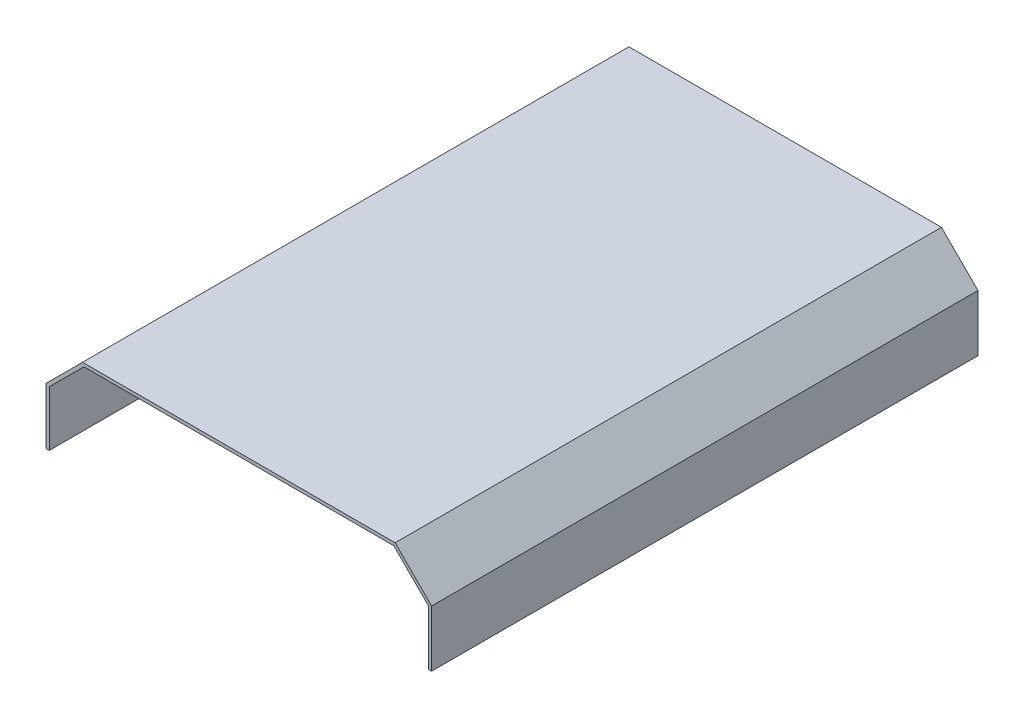
ISO-10303-21;
HEADER;
FILE_DESCRIPTION(('STEP AP214'),'2;1');
FILE_NAME('part.step','',(''),(''),'','','');
FILE_SCHEMA(('AUTOMOTIVE_DESIGN { 1 0 10303 214 1 1 1 1 }'));
ENDSEC;
DATA;
#1=APPLICATION_CONTEXT('core data for automotive mechanical design processes');
#2=APPLICATION_PROTOCOL_DEFINITION('international standard','automotive_design',2000,#1);
#3=PRODUCT_CONTEXT('',#1,'mechanical');
#4=PRODUCT('Part','Part','',(#3));
#5=PRODUCT_RELATED_PRODUCT_CATEGORY('part','',(#4));
#6=PRODUCT_DEFINITION_FORMATION('','',#4);
#7=PRODUCT_DEFINITION_CONTEXT('part definition',#1,'design');
#8=PRODUCT_DEFINITION('design','',#6,#7);
#9=PRODUCT_DEFINITION_SHAPE('','',#8);
#10=(LENGTH_UNIT() NAMED_UNIT(*) SI_UNIT(.MILLI.,.METRE.));
#11=(NAMED_UNIT(*) PLANE_ANGLE_UNIT() SI_UNIT($,.RADIAN.));
#12=(NAMED_UNIT(*) SI_UNIT($,.STERADIAN.) SOLID_ANGLE_UNIT());
#13=UNCERTAINTY_MEASURE_WITH_UNIT(LENGTH_MEASURE(1.E-05),#10,'distance_accuracy_value','');
#14=(GEOMETRIC_REPRESENTATION_CONTEXT(3) GLOBAL_UNCERTAINTY_ASSIGNED_CONTEXT((#13)) GLOBAL_UNIT_ASSIGNED_CONTEXT((#10,
#11,#12)) REPRESENTATION_CONTEXT('',''));
#15=CARTESIAN_POINT('',(0.,0.,0.));
#16=DIRECTION('',(0.,0.,1.));
#17=DIRECTION('',(1.,0.,0.));
#18=AXIS2_PLACEMENT_3D('',#15,#16,#17);
#19=CARTESIAN_POINT('',(-2.,0.,335.));
#20=DIRECTION('',(0.,1.,0.));
#21=DIRECTION('',(0.,0.,1.));
#22=AXIS2_PLACEMENT_3D('',#19,#20,#21);
#23=PLANE('',#22);
#24=DIRECTION('',(1.,0.,0.));
#25=VECTOR('',#24,1.);
#26=CARTESIAN_POINT('',(-2.,0.,0.));
#27=LINE('',#26,#25);
#28=CARTESIAN_POINT('',(-2.,0.,0.));
#29=VERTEX_POINT('',#28);
#30=CARTESIAN_POINT('',(0.,0.,0.));
#31=VERTEX_POINT('',#30);
#32=EDGE_CURVE('E153',#29,#31,#27,.T.);
#33=ORIENTED_EDGE('',*,*,#32,.T.);
#34=DIRECTION('',(0.,0.,-1.));
#35=VECTOR('',#34,1.);
#36=CARTESIAN_POINT('',(0.,0.,335.));
#37=LINE('',#36,#35);
#38=CARTESIAN_POINT('',(0.,0.,335.));
#39=VERTEX_POINT('',#38);
#40=EDGE_CURVE('E11',#39,#31,#37,.T.);
#41=ORIENTED_EDGE('',*,*,#40,.F.);
#42=DIRECTION('',(1.,0.,0.));
#43=VECTOR('',#42,1.);
#44=CARTESIAN_POINT('',(-2.,0.,335.));
#45=LINE('',#44,#43);
#46=CARTESIAN_POINT('',(-2.,0.,335.));
#47=VERTEX_POINT('',#46);
#48=EDGE_CURVE('E175',#47,#39,#45,.T.);
#49=ORIENTED_EDGE('',*,*,#48,.F.);
#50=DIRECTION('',(0.,0.,-1.));
#51=VECTOR('',#50,1.);
#52=CARTESIAN_POINT('',(-2.,0.,335.));
#53=LINE('',#52,#51);
#54=EDGE_CURVE('E149',#47,#29,#53,.T.);
#55=ORIENTED_EDGE('',*,*,#54,.T.);
#56=EDGE_LOOP('',(#33,#41,#49,#55));
#57=FACE_BOUND('',#56,.T.);
#58=ADVANCED_FACE('F33',(#57),#23,.F.);
#59=CARTESIAN_POINT('',(0.,0.,335.));
#60=DIRECTION('',(-1.,0.,0.));
#61=DIRECTION('',(0.,0.,1.));
#62=AXIS2_PLACEMENT_3D('',#59,#60,#61);
#63=PLANE('',#62);
#64=DIRECTION('',(0.,1.,0.));
#65=VECTOR('',#64,1.);
#66=CARTESIAN_POINT('',(0.,0.,0.));
#67=LINE('',#66,#65);
#68=CARTESIAN_POINT('',(0.,33.79,0.));
#69=VERTEX_POINT('',#68);
#70=EDGE_CURVE('E156',#31,#69,#67,.T.);
#71=ORIENTED_EDGE('',*,*,#70,.T.);
#72=DIRECTION('',(0.,0.,-1.));
#73=VECTOR('',#72,1.);
#74=CARTESIAN_POINT('',(0.,33.79,335.));
#75=LINE('',#74,#73);
#76=CARTESIAN_POINT('',(0.,33.79,335.));
#77=VERTEX_POINT('',#76);
#78=EDGE_CURVE('E41',#77,#69,#75,.T.);
#79=ORIENTED_EDGE('',*,*,#78,.F.);
#80=DIRECTION('',(0.,1.,0.));
#81=VECTOR('',#80,1.);
#82=CARTESIAN_POINT('',(0.,0.,335.));
#83=LINE('',#82,#81);
#84=EDGE_CURVE('E104',#39,#77,#83,.T.);
#85=ORIENTED_EDGE('',*,*,#84,.F.);
#86=ORIENTED_EDGE('',*,*,#40,.T.);
#87=EDGE_LOOP('',(#71,#79,#85,#86));
#88=FACE_BOUND('',#87,.T.);
#89=ADVANCED_FACE('F253',(#88),#63,.F.);
#90=CARTESIAN_POINT('',(0.,33.79,335.));
#91=DIRECTION('',(-0.707106781186546,0.707106781186549,0.));
#92=DIRECTION('',(-0.707106781186549,-0.707106781186546,0.));
#93=AXIS2_PLACEMENT_3D('',#90,#91,#92);
#94=PLANE('',#93);
#95=DIRECTION('',(0.707106781186549,0.707106781186546,0.));
#96=VECTOR('',#95,1.);
#97=CARTESIAN_POINT('',(0.,33.79,0.));
#98=LINE('',#97,#96);
#99=CARTESIAN_POINT('',(21.2132034355965,55.0032034355964,0.));
#100=VERTEX_POINT('',#99);
#101=EDGE_CURVE('E158',#69,#100,#98,.T.);
#102=ORIENTED_EDGE('',*,*,#101,.T.);
#103=DIRECTION('',(0.,0.,-1.));
#104=VECTOR('',#103,1.);
#105=CARTESIAN_POINT('',(21.2132034355965,55.0032034355964,335.));
#106=LINE('',#105,#104);
#107=CARTESIAN_POINT('',(21.2132034355965,55.0032034355964,335.));
#108=VERTEX_POINT('',#107);
#109=EDGE_CURVE('E194',#108,#100,#106,.T.);
#110=ORIENTED_EDGE('',*,*,#109,.F.);
#111=DIRECTION('',(0.707106781186549,0.707106781186546,0.));
#112=VECTOR('',#111,1.);
#113=CARTESIAN_POINT('',(0.,33.79,335.));
#114=LINE('',#113,#112);
#115=EDGE_CURVE('E202',#77,#108,#114,.T.);
#116=ORIENTED_EDGE('',*,*,#115,.F.);
#117=ORIENTED_EDGE('',*,*,#78,.T.);
#118=EDGE_LOOP('',(#102,#110,#116,#117));
#119=FACE_BOUND('',#118,.T.);
#120=ADVANCED_FACE('F200',(#119),#94,.F.);
#121=CARTESIAN_POINT('',(21.2132034355965,55.0032034355964,335.));
#122=DIRECTION('',(0.,1.,0.));
#123=DIRECTION('',(-1.,0.,0.));
#124=AXIS2_PLACEMENT_3D('',#121,#122,#123);
#125=PLANE('',#124);
#126=DIRECTION('',(1.,0.,0.));
#127=VECTOR('',#126,1.);
#128=CARTESIAN_POINT('',(21.2132034355965,55.0032034355964,0.));
#129=LINE('',#128,#127);
#130=CARTESIAN_POINT('',(211.213203435596,55.0032034355964,0.));
#131=VERTEX_POINT('',#130);
#132=EDGE_CURVE('E160',#100,#131,#129,.T.);
#133=ORIENTED_EDGE('',*,*,#132,.T.);
#134=DIRECTION('',(0.,0.,-1.));
#135=VECTOR('',#134,1.);
#136=CARTESIAN_POINT('',(211.213203435596,55.0032034355964,335.));
#137=LINE('',#136,#135);
#138=CARTESIAN_POINT('',(211.213203435596,55.0032034355964,335.));
#139=VERTEX_POINT('',#138);
#140=EDGE_CURVE('E191',#139,#131,#137,.T.);
#141=ORIENTED_EDGE('',*,*,#140,.F.);
#142=DIRECTION('',(1.,0.,0.));
#143=VECTOR('',#142,1.);
#144=CARTESIAN_POINT('',(21.2132034355965,55.0032034355964,335.));
#145=LINE('',#144,#143);
#146=EDGE_CURVE('E220',#108,#139,#145,.T.);
#147=ORIENTED_EDGE('',*,*,#146,.F.);
#148=ORIENTED_EDGE('',*,*,#109,.T.);
#149=EDGE_LOOP('',(#133,#141,#147,#148));
#150=FACE_BOUND('',#149,.T.);
#151=ADVANCED_FACE('F211',(#150),#125,.F.);
#152=CARTESIAN_POINT('',(211.213203435596,55.0032034355964,335.));
#153=DIRECTION('',(0.707106781186548,0.707106781186547,0.));
#154=DIRECTION('',(-0.707106781186547,0.707106781186548,0.));
#155=AXIS2_PLACEMENT_3D('',#152,#153,#154);
#156=PLANE('',#155);
#157=DIRECTION('',(0.707106781186547,-0.707106781186548,0.));
#158=VECTOR('',#157,1.);
#159=CARTESIAN_POINT('',(211.213203435596,55.0032034355964,0.));
#160=LINE('',#159,#158);
#161=CARTESIAN_POINT('',(232.426406871193,33.7899999999999,0.));
#162=VERTEX_POINT('',#161);
#163=EDGE_CURVE('E162',#131,#162,#160,.T.);
#164=ORIENTED_EDGE('',*,*,#163,.T.);
#165=DIRECTION('',(0.,0.,-1.));
#166=VECTOR('',#165,1.);
#167=CARTESIAN_POINT('',(232.426406871193,33.7899999999999,335.));
#168=LINE('',#167,#166);
#169=CARTESIAN_POINT('',(232.426406871193,33.7899999999999,335.));
#170=VERTEX_POINT('',#169);
#171=EDGE_CURVE('E188',#170,#162,#168,.T.);
#172=ORIENTED_EDGE('',*,*,#171,.F.);
#173=DIRECTION('',(0.707106781186547,-0.707106781186548,0.));
#174=VECTOR('',#173,1.);
#175=CARTESIAN_POINT('',(211.213203435596,55.0032034355964,335.));
#176=LINE('',#175,#174);
#177=EDGE_CURVE('E217',#139,#170,#176,.T.);
#178=ORIENTED_EDGE('',*,*,#177,.F.);
#179=ORIENTED_EDGE('',*,*,#140,.T.);
#180=EDGE_LOOP('',(#164,#172,#178,#179));
#181=FACE_BOUND('',#180,.T.);
#182=ADVANCED_FACE('F215',(#181),#156,.F.);
#183=CARTESIAN_POINT('',(232.426406871193,33.7899999999999,335.));
#184=DIRECTION('',(1.,0.,0.));
#185=DIRECTION('',(0.,1.,0.));
#186=AXIS2_PLACEMENT_3D('',#183,#184,#185);
#187=PLANE('',#186);
#188=DIRECTION('',(0.,-1.,0.));
#189=VECTOR('',#188,1.);
#190=CARTESIAN_POINT('',(232.426406871193,33.7899999999999,0.));
#191=LINE('',#190,#189);
#192=CARTESIAN_POINT('',(232.426406871193,0.,0.));
#193=VERTEX_POINT('',#192);
#194=EDGE_CURVE('E164',#162,#193,#191,.T.);
#195=ORIENTED_EDGE('',*,*,#194,.T.);
#196=DIRECTION('',(0.,0.,-1.));
#197=VECTOR('',#196,1.);
#198=CARTESIAN_POINT('',(232.426406871193,0.,335.));
#199=LINE('',#198,#197);
#200=CARTESIAN_POINT('',(232.426406871193,0.,335.));
#201=VERTEX_POINT('',#200);
#202=EDGE_CURVE('E185',#201,#193,#199,.T.);
#203=ORIENTED_EDGE('',*,*,#202,.F.);
#204=DIRECTION('',(0.,-1.,0.));
#205=VECTOR('',#204,1.);
#206=CARTESIAN_POINT('',(232.426406871193,33.7899999999999,335.));
#207=LINE('',#206,#205);
#208=EDGE_CURVE('E219',#170,#201,#207,.T.);
#209=ORIENTED_EDGE('',*,*,#208,.F.);
#210=ORIENTED_EDGE('',*,*,#171,.T.);
#211=EDGE_LOOP('',(#195,#203,#209,#210));
#212=FACE_BOUND('',#211,.T.);
#213=ADVANCED_FACE('F266',(#212),#187,.F.);
#214=CARTESIAN_POINT('',(232.426406871193,0.,335.));
#215=DIRECTION('',(0.,1.,0.));
#216=DIRECTION('',(0.,0.,1.));
#217=AXIS2_PLACEMENT_3D('',#214,#215,#216);
#218=PLANE('',#217);
#219=DIRECTION('',(1.,0.,0.));
#220=VECTOR('',#219,1.);
#221=CARTESIAN_POINT('',(232.426406871193,0.,0.));
#222=LINE('',#221,#220);
#223=CARTESIAN_POINT('',(234.426406871193,0.,0.));
#224=VERTEX_POINT('',#223);
#225=EDGE_CURVE('E166',#193,#224,#222,.T.);
#226=ORIENTED_EDGE('',*,*,#225,.T.);
#227=DIRECTION('',(0.,0.,-1.));
#228=VECTOR('',#227,1.);
#229=CARTESIAN_POINT('',(234.426406871193,0.,335.));
#230=LINE('',#229,#228);
#231=CARTESIAN_POINT('',(234.426406871193,0.,335.));
#232=VERTEX_POINT('',#231);
#233=EDGE_CURVE('E182',#232,#224,#230,.T.);
#234=ORIENTED_EDGE('',*,*,#233,.F.);
#235=DIRECTION('',(1.,0.,0.));
#236=VECTOR('',#235,1.);
#237=CARTESIAN_POINT('',(232.426406871193,0.,335.));
#238=LINE('',#237,#236);
#239=EDGE_CURVE('E222',#201,#232,#238,.T.);
#240=ORIENTED_EDGE('',*,*,#239,.F.);
#241=ORIENTED_EDGE('',*,*,#202,.T.);
#242=EDGE_LOOP('',(#226,#234,#240,#241));
#243=FACE_BOUND('',#242,.T.);
#244=ADVANCED_FACE('F269',(#243),#218,.F.);
#245=CARTESIAN_POINT('',(234.426406871193,34.6184271247462,335.));
#246=DIRECTION('',(-1.,0.,0.));
#247=DIRECTION('',(0.,0.,1.));
#248=AXIS2_PLACEMENT_3D('',#245,#246,#247);
#249=PLANE('',#248);
#250=DIRECTION('',(0.,1.,0.));
#251=VECTOR('',#250,1.);
#252=CARTESIAN_POINT('',(234.426406871193,34.6184271247462,0.));
#253=LINE('',#252,#251);
#254=CARTESIAN_POINT('',(234.426406871193,34.6184271247462,0.));
#255=VERTEX_POINT('',#254);
#256=EDGE_CURVE('E168',#224,#255,#253,.T.);
#257=ORIENTED_EDGE('',*,*,#256,.T.);
#258=DIRECTION('',(0.,0.,-1.));
#259=VECTOR('',#258,1.);
#260=CARTESIAN_POINT('',(234.426406871193,34.6184271247462,335.));
#261=LINE('',#260,#259);
#262=CARTESIAN_POINT('',(234.426406871193,34.6184271247462,335.));
#263=VERTEX_POINT('',#262);
#264=EDGE_CURVE('E179',#263,#255,#261,.T.);
#265=ORIENTED_EDGE('',*,*,#264,.F.);
#266=DIRECTION('',(0.,1.,0.));
#267=VECTOR('',#266,1.);
#268=CARTESIAN_POINT('',(234.426406871193,34.6184271247462,335.));
#269=LINE('',#268,#267);
#270=EDGE_CURVE('E228',#232,#263,#269,.T.);
#271=ORIENTED_EDGE('',*,*,#270,.F.);
#272=ORIENTED_EDGE('',*,*,#233,.T.);
#273=EDGE_LOOP('',(#257,#265,#271,#272));
#274=FACE_BOUND('',#273,.T.);
#275=ADVANCED_FACE('F234',(#274),#249,.F.);
#276=CARTESIAN_POINT('',(212.041630560343,57.0032034355964,335.));
#277=DIRECTION('',(-0.707106781186547,-0.707106781186548,0.));
#278=DIRECTION('',(0.707106781186548,-0.707106781186547,0.));
#279=AXIS2_PLACEMENT_3D('',#276,#277,#278);
#280=PLANE('',#279);
#281=DIRECTION('',(-0.707106781186548,0.707106781186547,0.));
#282=VECTOR('',#281,1.);
#283=CARTESIAN_POINT('',(212.041630560343,57.0032034355964,0.));
#284=LINE('',#283,#282);
#285=CARTESIAN_POINT('',(212.041630560343,57.0032034355964,0.));
#286=VERTEX_POINT('',#285);
#287=EDGE_CURVE('E170',#255,#286,#284,.T.);
#288=ORIENTED_EDGE('',*,*,#287,.T.);
#289=DIRECTION('',(0.,0.,-1.));
#290=VECTOR('',#289,1.);
#291=CARTESIAN_POINT('',(212.041630560343,57.0032034355964,335.));
#292=LINE('',#291,#290);
#293=CARTESIAN_POINT('',(212.041630560343,57.0032034355964,335.));
#294=VERTEX_POINT('',#293);
#295=EDGE_CURVE('E144',#294,#286,#292,.T.);
#296=ORIENTED_EDGE('',*,*,#295,.F.);
#297=DIRECTION('',(-0.707106781186548,0.707106781186547,0.));
#298=VECTOR('',#297,1.);
#299=CARTESIAN_POINT('',(212.041630560343,57.0032034355964,335.));
#300=LINE('',#299,#298);
#301=EDGE_CURVE('E135',#263,#294,#300,.T.);
#302=ORIENTED_EDGE('',*,*,#301,.F.);
#303=ORIENTED_EDGE('',*,*,#264,.T.);
#304=EDGE_LOOP('',(#288,#296,#302,#303));
#305=FACE_BOUND('',#304,.T.);
#306=ADVANCED_FACE('F238',(#305),#280,.F.);
#307=CARTESIAN_POINT('',(20.3847763108502,57.0032034355964,335.));
#308=DIRECTION('',(0.,-1.,0.));
#309=DIRECTION('',(0.,0.,-1.));
#310=AXIS2_PLACEMENT_3D('',#307,#308,#309);
#311=PLANE('',#310);
#312=DIRECTION('',(-1.,0.,0.));
#313=VECTOR('',#312,1.);
#314=CARTESIAN_POINT('',(20.3847763108502,57.0032034355964,0.));
#315=LINE('',#314,#313);
#316=CARTESIAN_POINT('',(20.3847763108502,57.0032034355964,0.));
#317=VERTEX_POINT('',#316);
#318=EDGE_CURVE('E143',#286,#317,#315,.T.);
#319=ORIENTED_EDGE('',*,*,#318,.T.);
#320=DIRECTION('',(0.,0.,-1.));
#321=VECTOR('',#320,1.);
#322=CARTESIAN_POINT('',(20.3847763108502,57.0032034355964,335.));
#323=LINE('',#322,#321);
#324=CARTESIAN_POINT('',(20.3847763108502,57.0032034355964,335.));
#325=VERTEX_POINT('',#324);
#326=EDGE_CURVE('E140',#325,#317,#323,.T.);
#327=ORIENTED_EDGE('',*,*,#326,.F.);
#328=DIRECTION('',(-1.,0.,0.));
#329=VECTOR('',#328,1.);
#330=CARTESIAN_POINT('',(20.3847763108502,57.0032034355964,335.));
#331=LINE('',#330,#329);
#332=EDGE_CURVE('E129',#294,#325,#331,.T.);
#333=ORIENTED_EDGE('',*,*,#332,.F.);
#334=ORIENTED_EDGE('',*,*,#295,.T.);
#335=EDGE_LOOP('',(#319,#327,#333,#334));
#336=FACE_BOUND('',#335,.T.);
#337=ADVANCED_FACE('F141',(#336),#311,.F.);
#338=CARTESIAN_POINT('',(-2.,34.6184271247462,335.));
#339=DIRECTION('',(0.707106781186548,-0.707106781186548,0.));
#340=DIRECTION('',(0.707106781186548,0.707106781186548,0.));
#341=AXIS2_PLACEMENT_3D('',#338,#339,#340);
#342=PLANE('',#341);
#343=DIRECTION('',(-0.707106781186548,-0.707106781186548,0.));
#344=VECTOR('',#343,1.);
#345=CARTESIAN_POINT('',(-2.,34.6184271247462,0.));
#346=LINE('',#345,#344);
#347=CARTESIAN_POINT('',(-2.,34.6184271247462,0.));
#348=VERTEX_POINT('',#347);
#349=EDGE_CURVE('E90',#317,#348,#346,.T.);
#350=ORIENTED_EDGE('',*,*,#349,.T.);
#351=DIRECTION('',(0.,0.,-1.));
#352=VECTOR('',#351,1.);
#353=CARTESIAN_POINT('',(-2.,34.6184271247462,335.));
#354=LINE('',#353,#352);
#355=CARTESIAN_POINT('',(-2.,34.6184271247462,335.));
#356=VERTEX_POINT('',#355);
#357=EDGE_CURVE('E145',#356,#348,#354,.T.);
#358=ORIENTED_EDGE('',*,*,#357,.F.);
#359=DIRECTION('',(-0.707106781186548,-0.707106781186548,0.));
#360=VECTOR('',#359,1.);
#361=CARTESIAN_POINT('',(-2.,34.6184271247462,335.));
#362=LINE('',#361,#360);
#363=EDGE_CURVE('E133',#325,#356,#362,.T.);
#364=ORIENTED_EDGE('',*,*,#363,.F.);
#365=ORIENTED_EDGE('',*,*,#326,.T.);
#366=EDGE_LOOP('',(#350,#358,#364,#365));
#367=FACE_BOUND('',#366,.T.);
#368=ADVANCED_FACE('F147',(#367),#342,.F.);
#369=CARTESIAN_POINT('',(-2.,0.,335.));
#370=DIRECTION('',(1.,0.,0.));
#371=DIRECTION('',(0.,0.,-1.));
#372=AXIS2_PLACEMENT_3D('',#369,#370,#371);
#373=PLANE('',#372);
#374=DIRECTION('',(0.,-1.,0.));
#375=VECTOR('',#374,1.);
#376=CARTESIAN_POINT('',(-2.,0.,0.));
#377=LINE('',#376,#375);
#378=EDGE_CURVE('E96',#348,#29,#377,.T.);
#379=ORIENTED_EDGE('',*,*,#378,.T.);
#380=ORIENTED_EDGE('',*,*,#54,.F.);
#381=DIRECTION('',(0.,-1.,0.));
#382=VECTOR('',#381,1.);
#383=CARTESIAN_POINT('',(-2.,0.,335.));
#384=LINE('',#383,#382);
#385=EDGE_CURVE('E49',#356,#47,#384,.T.);
#386=ORIENTED_EDGE('',*,*,#385,.F.);
#387=ORIENTED_EDGE('',*,*,#357,.T.);
#388=EDGE_LOOP('',(#379,#380,#386,#387));
#389=FACE_BOUND('',#388,.T.);
#390=ADVANCED_FACE('F242',(#389),#373,.F.);
#391=CARTESIAN_POINT('',(0.,0.,335.));
#392=DIRECTION('',(0.,0.,1.));
#393=DIRECTION('',(1.,0.,0.));
#394=AXIS2_PLACEMENT_3D('',#391,#392,#393);
#395=PLANE('',#394);
#396=ORIENTED_EDGE('',*,*,#48,.T.);
#397=ORIENTED_EDGE('',*,*,#84,.T.);
#398=ORIENTED_EDGE('',*,*,#115,.T.);
#399=ORIENTED_EDGE('',*,*,#146,.T.);
#400=ORIENTED_EDGE('',*,*,#177,.T.);
#401=ORIENTED_EDGE('',*,*,#208,.T.);
#402=ORIENTED_EDGE('',*,*,#239,.T.);
#403=ORIENTED_EDGE('',*,*,#270,.T.);
#404=ORIENTED_EDGE('',*,*,#301,.T.);
#405=ORIENTED_EDGE('',*,*,#332,.T.);
#406=ORIENTED_EDGE('',*,*,#363,.T.);
#407=ORIENTED_EDGE('',*,*,#385,.T.);
#408=EDGE_LOOP('',(#396,#397,#398,#399,#400,#401,#402,#403,#404,#405,#406,#407));
#409=FACE_BOUND('',#408,.T.);
#410=ADVANCED_FACE('F131',(#409),#395,.T.);
#411=CARTESIAN_POINT('',(0.,0.,0.));
#412=DIRECTION('',(0.,0.,1.));
#413=DIRECTION('',(1.,0.,0.));
#414=AXIS2_PLACEMENT_3D('',#411,#412,#413);
#415=PLANE('',#414);
#416=ORIENTED_EDGE('',*,*,#32,.F.);
#417=ORIENTED_EDGE('',*,*,#378,.F.);
#418=ORIENTED_EDGE('',*,*,#349,.F.);
#419=ORIENTED_EDGE('',*,*,#318,.F.);
#420=ORIENTED_EDGE('',*,*,#287,.F.);
#421=ORIENTED_EDGE('',*,*,#256,.F.);
#422=ORIENTED_EDGE('',*,*,#225,.F.);
#423=ORIENTED_EDGE('',*,*,#194,.F.);
#424=ORIENTED_EDGE('',*,*,#163,.F.);
#425=ORIENTED_EDGE('',*,*,#132,.F.);
#426=ORIENTED_EDGE('',*,*,#101,.F.);
#427=ORIENTED_EDGE('',*,*,#70,.F.);
#428=EDGE_LOOP('',(#416,#417,#418,#419,#420,#421,#422,#423,#424,#425,#426,#427));
#429=FACE_BOUND('',#428,.T.);
#430=ADVANCED_FACE('F206',(#429),#415,.F.);
#431=CLOSED_SHELL('',(#58,#89,#120,#151,#182,#213,#244,#275,#306,#337,#368,#390,#410,#430));
#432=MANIFOLD_SOLID_BREP('B2',#431);
#433=ADVANCED_BREP_SHAPE_REPRESENTATION('',(#18,#432),#14);
#434=SHAPE_DEFINITION_REPRESENTATION(#9,#433);
ENDSEC;
END-ISO-10303-21;
